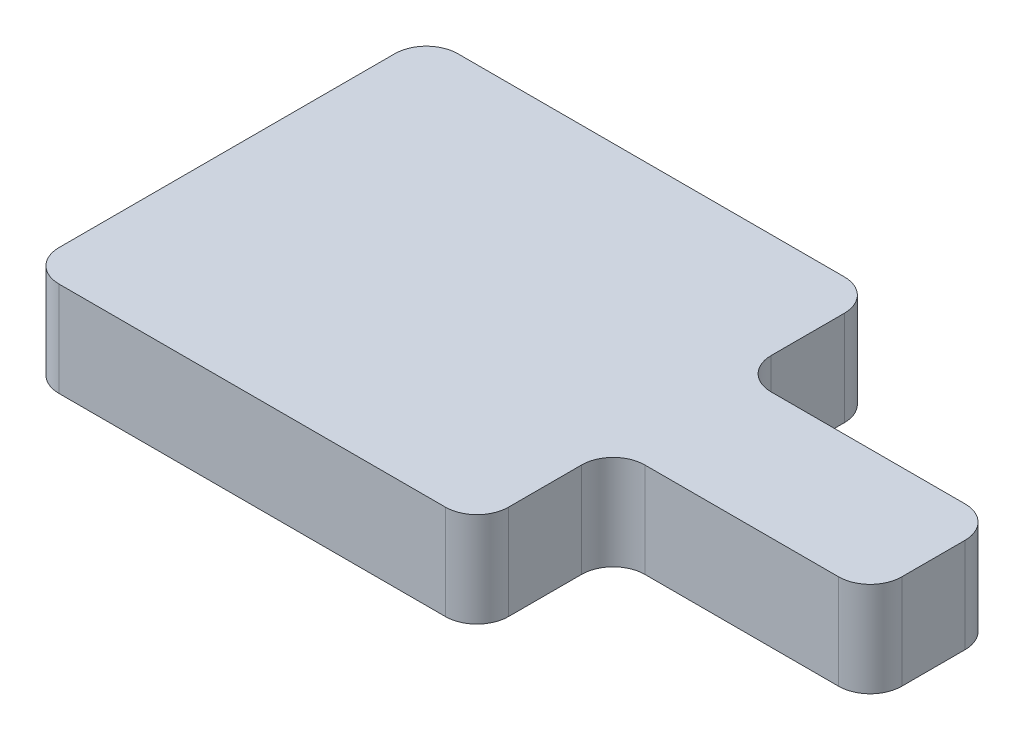
ISO-10303-21;
HEADER;
FILE_DESCRIPTION(('STEP AP214'),'2;1');
FILE_NAME('part.step','',(''),(''),'','','');
FILE_SCHEMA(('AUTOMOTIVE_DESIGN { 1 0 10303 214 1 1 1 1 }'));
ENDSEC;
DATA;
#1=APPLICATION_CONTEXT('core data for automotive mechanical design processes');
#2=APPLICATION_PROTOCOL_DEFINITION('international standard','automotive_design',2000,#1);
#3=PRODUCT_CONTEXT('',#1,'mechanical');
#4=PRODUCT('Part','Part','',(#3));
#5=PRODUCT_RELATED_PRODUCT_CATEGORY('part','',(#4));
#6=PRODUCT_DEFINITION_FORMATION('','',#4);
#7=PRODUCT_DEFINITION_CONTEXT('part definition',#1,'design');
#8=PRODUCT_DEFINITION('design','',#6,#7);
#9=PRODUCT_DEFINITION_SHAPE('','',#8);
#10=(LENGTH_UNIT() NAMED_UNIT(*) SI_UNIT(.MILLI.,.METRE.));
#11=(NAMED_UNIT(*) PLANE_ANGLE_UNIT() SI_UNIT($,.RADIAN.));
#12=(NAMED_UNIT(*) SI_UNIT($,.STERADIAN.) SOLID_ANGLE_UNIT());
#13=UNCERTAINTY_MEASURE_WITH_UNIT(LENGTH_MEASURE(1.E-05),#10,'distance_accuracy_value','');
#14=(GEOMETRIC_REPRESENTATION_CONTEXT(3) GLOBAL_UNCERTAINTY_ASSIGNED_CONTEXT((#13)) GLOBAL_UNIT_ASSIGNED_CONTEXT((#10,
#11,#12)) REPRESENTATION_CONTEXT('',''));
#15=CARTESIAN_POINT('',(0.,0.,0.));
#16=DIRECTION('',(0.,0.,1.));
#17=DIRECTION('',(1.,0.,0.));
#18=AXIS2_PLACEMENT_3D('',#15,#16,#17);
#19=CARTESIAN_POINT('',(83.9903657583398,-19.05,-6.35));
#20=DIRECTION('',(0.,1.,0.));
#21=DIRECTION('',(0.,0.,1.));
#22=AXIS2_PLACEMENT_3D('',#19,#20,#21);
#23=CYLINDRICAL_SURFACE('',#22,6.35);
#24=CARTESIAN_POINT('',(83.9903657583398,0.,-6.35));
#25=DIRECTION('',(0.,1.,0.));
#26=DIRECTION('',(0.,0.,1.));
#27=AXIS2_PLACEMENT_3D('',#24,#25,#26);
#28=CIRCLE('',#27,6.35);
#29=CARTESIAN_POINT('',(83.9903657583397,0.,0.));
#30=VERTEX_POINT('',#29);
#31=CARTESIAN_POINT('',(90.3403657583398,0.,-6.35));
#32=VERTEX_POINT('',#31);
#33=EDGE_CURVE('E176',#30,#32,#28,.T.);
#34=ORIENTED_EDGE('',*,*,#33,.F.);
#35=DIRECTION('',(0.,1.,0.));
#36=VECTOR('',#35,1.);
#37=CARTESIAN_POINT('',(83.9903657583397,-19.05,0.));
#38=LINE('',#37,#36);
#39=CARTESIAN_POINT('',(83.9903657583397,-19.05,0.));
#40=VERTEX_POINT('',#39);
#41=EDGE_CURVE('E11',#40,#30,#38,.T.);
#42=ORIENTED_EDGE('',*,*,#41,.F.);
#43=CARTESIAN_POINT('',(83.9903657583398,-19.05,-6.35));
#44=DIRECTION('',(0.,1.,0.));
#45=DIRECTION('',(0.,0.,1.));
#46=AXIS2_PLACEMENT_3D('',#43,#44,#45);
#47=CIRCLE('',#46,6.35);
#48=CARTESIAN_POINT('',(90.3403657583398,-19.05,-6.35));
#49=VERTEX_POINT('',#48);
#50=EDGE_CURVE('E220',#40,#49,#47,.T.);
#51=ORIENTED_EDGE('',*,*,#50,.T.);
#52=DIRECTION('',(0.,1.,0.));
#53=VECTOR('',#52,1.);
#54=CARTESIAN_POINT('',(90.3403657583398,-19.05,-6.35));
#55=LINE('',#54,#53);
#56=EDGE_CURVE('E34',#49,#32,#55,.T.);
#57=ORIENTED_EDGE('',*,*,#56,.T.);
#58=EDGE_LOOP('',(#34,#42,#51,#57));
#59=FACE_BOUND('',#58,.T.);
#60=ADVANCED_FACE('F31',(#59),#23,.T.);
#61=CARTESIAN_POINT('',(6.35,-19.05,0.));
#62=DIRECTION('',(0.,0.,1.));
#63=DIRECTION('',(1.,0.,0.));
#64=AXIS2_PLACEMENT_3D('',#61,#62,#63);
#65=PLANE('',#64);
#66=DIRECTION('',(1.,0.,0.));
#67=VECTOR('',#66,1.);
#68=CARTESIAN_POINT('',(6.35,0.,0.));
#69=LINE('',#68,#67);
#70=CARTESIAN_POINT('',(6.35,0.,0.));
#71=VERTEX_POINT('',#70);
#72=EDGE_CURVE('E218',#71,#30,#69,.T.);
#73=ORIENTED_EDGE('',*,*,#72,.F.);
#74=DIRECTION('',(0.,1.,0.));
#75=VECTOR('',#74,1.);
#76=CARTESIAN_POINT('',(6.35,-19.05,0.));
#77=LINE('',#76,#75);
#78=CARTESIAN_POINT('',(6.35,-19.05,0.));
#79=VERTEX_POINT('',#78);
#80=EDGE_CURVE('E40',#79,#71,#77,.T.);
#81=ORIENTED_EDGE('',*,*,#80,.F.);
#82=DIRECTION('',(1.,0.,0.));
#83=VECTOR('',#82,1.);
#84=CARTESIAN_POINT('',(6.35,-19.05,0.));
#85=LINE('',#84,#83);
#86=EDGE_CURVE('E166',#79,#40,#85,.T.);
#87=ORIENTED_EDGE('',*,*,#86,.T.);
#88=ORIENTED_EDGE('',*,*,#41,.T.);
#89=EDGE_LOOP('',(#73,#81,#87,#88));
#90=FACE_BOUND('',#89,.T.);
#91=ADVANCED_FACE('F248',(#90),#65,.T.);
#92=CARTESIAN_POINT('',(6.35,-19.05,-6.35));
#93=DIRECTION('',(0.,1.,0.));
#94=DIRECTION('',(0.,0.,1.));
#95=AXIS2_PLACEMENT_3D('',#92,#93,#94);
#96=CYLINDRICAL_SURFACE('',#95,6.35);
#97=CARTESIAN_POINT('',(6.35,0.,-6.35));
#98=DIRECTION('',(0.,1.,0.));
#99=DIRECTION('',(0.,0.,-1.));
#100=AXIS2_PLACEMENT_3D('',#97,#98,#99);
#101=CIRCLE('',#100,6.35);
#102=CARTESIAN_POINT('',(0.,0.,-6.35));
#103=VERTEX_POINT('',#102);
#104=EDGE_CURVE('E153',#103,#71,#101,.T.);
#105=ORIENTED_EDGE('',*,*,#104,.F.);
#106=DIRECTION('',(0.,1.,0.));
#107=VECTOR('',#106,1.);
#108=CARTESIAN_POINT('',(0.,-19.05,-6.35));
#109=LINE('',#108,#107);
#110=CARTESIAN_POINT('',(0.,-19.05,-6.35));
#111=VERTEX_POINT('',#110);
#112=EDGE_CURVE('E148',#111,#103,#109,.T.);
#113=ORIENTED_EDGE('',*,*,#112,.F.);
#114=CARTESIAN_POINT('',(6.35,-19.05,-6.35));
#115=DIRECTION('',(0.,1.,0.));
#116=DIRECTION('',(0.,0.,-1.));
#117=AXIS2_PLACEMENT_3D('',#114,#115,#116);
#118=CIRCLE('',#117,6.35);
#119=EDGE_CURVE('E151',#111,#79,#118,.T.);
#120=ORIENTED_EDGE('',*,*,#119,.T.);
#121=ORIENTED_EDGE('',*,*,#80,.T.);
#122=EDGE_LOOP('',(#105,#113,#120,#121));
#123=FACE_BOUND('',#122,.T.);
#124=ADVANCED_FACE('F150',(#123),#96,.T.);
#125=CARTESIAN_POINT('',(0.,-19.05,-6.35));
#126=DIRECTION('',(-1.,0.,0.));
#127=DIRECTION('',(0.,0.,1.));
#128=AXIS2_PLACEMENT_3D('',#125,#126,#127);
#129=PLANE('',#128);
#130=DIRECTION('',(0.,0.,1.));
#131=VECTOR('',#130,1.);
#132=CARTESIAN_POINT('',(0.,0.,-6.35));
#133=LINE('',#132,#131);
#134=CARTESIAN_POINT('',(0.,0.,-73.8109677822809));
#135=VERTEX_POINT('',#134);
#136=EDGE_CURVE('E215',#135,#103,#133,.T.);
#137=ORIENTED_EDGE('',*,*,#136,.F.);
#138=DIRECTION('',(0.,1.,0.));
#139=VECTOR('',#138,1.);
#140=CARTESIAN_POINT('',(0.,-19.05,-73.8109677822809));
#141=LINE('',#140,#139);
#142=CARTESIAN_POINT('',(0.,-19.05,-73.8109677822809));
#143=VERTEX_POINT('',#142);
#144=EDGE_CURVE('E158',#143,#135,#141,.T.);
#145=ORIENTED_EDGE('',*,*,#144,.F.);
#146=DIRECTION('',(0.,0.,1.));
#147=VECTOR('',#146,1.);
#148=CARTESIAN_POINT('',(0.,-19.05,-6.35));
#149=LINE('',#148,#147);
#150=EDGE_CURVE('E164',#143,#111,#149,.T.);
#151=ORIENTED_EDGE('',*,*,#150,.T.);
#152=ORIENTED_EDGE('',*,*,#112,.T.);
#153=EDGE_LOOP('',(#137,#145,#151,#152));
#154=FACE_BOUND('',#153,.T.);
#155=ADVANCED_FACE('F168',(#154),#129,.T.);
#156=CARTESIAN_POINT('',(6.35,-19.05,-73.8109677822809));
#157=DIRECTION('',(0.,1.,0.));
#158=DIRECTION('',(0.,0.,1.));
#159=AXIS2_PLACEMENT_3D('',#156,#157,#158);
#160=CYLINDRICAL_SURFACE('',#159,6.35);
#161=CARTESIAN_POINT('',(6.35,0.,-73.8109677822809));
#162=DIRECTION('',(0.,1.,0.));
#163=DIRECTION('',(0.,0.,1.));
#164=AXIS2_PLACEMENT_3D('',#161,#162,#163);
#165=CIRCLE('',#164,6.35);
#166=CARTESIAN_POINT('',(6.35,0.,-80.1609677822809));
#167=VERTEX_POINT('',#166);
#168=EDGE_CURVE('E212',#167,#135,#165,.T.);
#169=ORIENTED_EDGE('',*,*,#168,.F.);
#170=DIRECTION('',(0.,1.,0.));
#171=VECTOR('',#170,1.);
#172=CARTESIAN_POINT('',(6.35,-19.05,-80.1609677822809));
#173=LINE('',#172,#171);
#174=CARTESIAN_POINT('',(6.35,-19.05,-80.1609677822809));
#175=VERTEX_POINT('',#174);
#176=EDGE_CURVE('E224',#175,#167,#173,.T.);
#177=ORIENTED_EDGE('',*,*,#176,.F.);
#178=CARTESIAN_POINT('',(6.35,-19.05,-73.8109677822809));
#179=DIRECTION('',(0.,1.,0.));
#180=DIRECTION('',(0.,0.,1.));
#181=AXIS2_PLACEMENT_3D('',#178,#179,#180);
#182=CIRCLE('',#181,6.35);
#183=EDGE_CURVE('E169',#175,#143,#182,.T.);
#184=ORIENTED_EDGE('',*,*,#183,.T.);
#185=ORIENTED_EDGE('',*,*,#144,.T.);
#186=EDGE_LOOP('',(#169,#177,#184,#185));
#187=FACE_BOUND('',#186,.T.);
#188=ADVANCED_FACE('F261',(#187),#160,.T.);
#189=CARTESIAN_POINT('',(6.35,-19.05,-80.1609677822809));
#190=DIRECTION('',(0.,0.,-1.));
#191=DIRECTION('',(-1.,0.,0.));
#192=AXIS2_PLACEMENT_3D('',#189,#190,#191);
#193=PLANE('',#192);
#194=DIRECTION('',(-1.,0.,0.));
#195=VECTOR('',#194,1.);
#196=CARTESIAN_POINT('',(6.35,0.,-80.1609677822809));
#197=LINE('',#196,#195);
#198=CARTESIAN_POINT('',(83.9903657583398,0.,-80.1609677822809));
#199=VERTEX_POINT('',#198);
#200=EDGE_CURVE('E209',#199,#167,#197,.T.);
#201=ORIENTED_EDGE('',*,*,#200,.F.);
#202=DIRECTION('',(0.,1.,0.));
#203=VECTOR('',#202,1.);
#204=CARTESIAN_POINT('',(83.9903657583398,-19.05,-80.1609677822809));
#205=LINE('',#204,#203);
#206=CARTESIAN_POINT('',(83.9903657583398,-19.05,-80.1609677822809));
#207=VERTEX_POINT('',#206);
#208=EDGE_CURVE('E226',#207,#199,#205,.T.);
#209=ORIENTED_EDGE('',*,*,#208,.F.);
#210=DIRECTION('',(-1.,0.,0.));
#211=VECTOR('',#210,1.);
#212=CARTESIAN_POINT('',(6.35,-19.05,-80.1609677822809));
#213=LINE('',#212,#211);
#214=EDGE_CURVE('E171',#207,#175,#213,.T.);
#215=ORIENTED_EDGE('',*,*,#214,.T.);
#216=ORIENTED_EDGE('',*,*,#176,.T.);
#217=EDGE_LOOP('',(#201,#209,#215,#216));
#218=FACE_BOUND('',#217,.T.);
#219=ADVANCED_FACE('F264',(#218),#193,.T.);
#220=CARTESIAN_POINT('',(83.9903657583398,-19.05,-73.8109677822809));
#221=DIRECTION('',(0.,1.,0.));
#222=DIRECTION('',(0.,0.,1.));
#223=AXIS2_PLACEMENT_3D('',#220,#221,#222);
#224=CYLINDRICAL_SURFACE('',#223,6.34999999999999);
#225=CARTESIAN_POINT('',(83.9903657583398,0.,-73.8109677822809));
#226=DIRECTION('',(0.,1.,0.));
#227=DIRECTION('',(0.,0.,-1.));
#228=AXIS2_PLACEMENT_3D('',#225,#226,#227);
#229=CIRCLE('',#228,6.34999999999999);
#230=CARTESIAN_POINT('',(90.3403657583398,0.,-73.8109677822809));
#231=VERTEX_POINT('',#230);
#232=EDGE_CURVE('E206',#231,#199,#229,.T.);
#233=ORIENTED_EDGE('',*,*,#232,.F.);
#234=DIRECTION('',(0.,1.,0.));
#235=VECTOR('',#234,1.);
#236=CARTESIAN_POINT('',(90.3403657583398,-19.05,-73.8109677822809));
#237=LINE('',#236,#235);
#238=CARTESIAN_POINT('',(90.3403657583398,-19.05,-73.8109677822809));
#239=VERTEX_POINT('',#238);
#240=EDGE_CURVE('E228',#239,#231,#237,.T.);
#241=ORIENTED_EDGE('',*,*,#240,.F.);
#242=CARTESIAN_POINT('',(83.9903657583398,-19.05,-73.8109677822809));
#243=DIRECTION('',(0.,1.,0.));
#244=DIRECTION('',(0.,0.,-1.));
#245=AXIS2_PLACEMENT_3D('',#242,#243,#244);
#246=CIRCLE('',#245,6.34999999999999);
#247=EDGE_CURVE('E445',#239,#207,#246,.T.);
#248=ORIENTED_EDGE('',*,*,#247,.T.);
#249=ORIENTED_EDGE('',*,*,#208,.T.);
#250=EDGE_LOOP('',(#233,#241,#248,#249));
#251=FACE_BOUND('',#250,.T.);
#252=ADVANCED_FACE('F268',(#251),#224,.T.);
#253=CARTESIAN_POINT('',(90.3403657583398,-19.05,-73.8109677822809));
#254=DIRECTION('',(1.,0.,0.));
#255=DIRECTION('',(0.,0.,-1.));
#256=AXIS2_PLACEMENT_3D('',#253,#254,#255);
#257=PLANE('',#256);
#258=DIRECTION('',(0.,0.,-1.));
#259=VECTOR('',#258,1.);
#260=CARTESIAN_POINT('',(90.3403657583398,0.,-73.8109677822809));
#261=LINE('',#260,#259);
#262=CARTESIAN_POINT('',(90.3403657583398,0.,-59.1304838911404));
#263=VERTEX_POINT('',#262);
#264=EDGE_CURVE('E203',#263,#231,#261,.T.);
#265=ORIENTED_EDGE('',*,*,#264,.F.);
#266=DIRECTION('',(0.,1.,0.));
#267=VECTOR('',#266,1.);
#268=CARTESIAN_POINT('',(90.3403657583398,-19.05,-59.1304838911404));
#269=LINE('',#268,#267);
#270=CARTESIAN_POINT('',(90.3403657583398,-19.05,-59.1304838911404));
#271=VERTEX_POINT('',#270);
#272=EDGE_CURVE('E230',#271,#263,#269,.T.);
#273=ORIENTED_EDGE('',*,*,#272,.F.);
#274=DIRECTION('',(0.,0.,-1.));
#275=VECTOR('',#274,1.);
#276=CARTESIAN_POINT('',(90.3403657583398,-19.05,-73.8109677822809));
#277=LINE('',#276,#275);
#278=EDGE_CURVE('E441',#271,#239,#277,.T.);
#279=ORIENTED_EDGE('',*,*,#278,.T.);
#280=ORIENTED_EDGE('',*,*,#240,.T.);
#281=EDGE_LOOP('',(#265,#273,#279,#280));
#282=FACE_BOUND('',#281,.T.);
#283=ADVANCED_FACE('F272',(#282),#257,.T.);
#284=CARTESIAN_POINT('',(96.6903657583398,-19.05,-59.1304838911404));
#285=DIRECTION('',(0.,1.,0.));
#286=DIRECTION('',(0.,0.,1.));
#287=AXIS2_PLACEMENT_3D('',#284,#285,#286);
#288=CYLINDRICAL_SURFACE('',#287,6.35);
#289=CARTESIAN_POINT('',(96.6903657583398,0.,-59.1304838911404));
#290=DIRECTION('',(0.,-1.,0.));
#291=DIRECTION('',(0.,0.,1.));
#292=AXIS2_PLACEMENT_3D('',#289,#290,#291);
#293=CIRCLE('',#292,6.35);
#294=CARTESIAN_POINT('',(96.6903657583398,0.,-52.7804838911404));
#295=VERTEX_POINT('',#294);
#296=EDGE_CURVE('E200',#295,#263,#293,.T.);
#297=ORIENTED_EDGE('',*,*,#296,.F.);
#298=DIRECTION('',(0.,1.,0.));
#299=VECTOR('',#298,1.);
#300=CARTESIAN_POINT('',(96.6903657583398,-19.05,-52.7804838911404));
#301=LINE('',#300,#299);
#302=CARTESIAN_POINT('',(96.6903657583398,-19.05,-52.7804838911404));
#303=VERTEX_POINT('',#302);
#304=EDGE_CURVE('E232',#303,#295,#301,.T.);
#305=ORIENTED_EDGE('',*,*,#304,.F.);
#306=CARTESIAN_POINT('',(96.6903657583398,-19.05,-59.1304838911404));
#307=DIRECTION('',(0.,-1.,0.));
#308=DIRECTION('',(0.,0.,1.));
#309=AXIS2_PLACEMENT_3D('',#306,#307,#308);
#310=CIRCLE('',#309,6.35);
#311=EDGE_CURVE('E452',#303,#271,#310,.T.);
#312=ORIENTED_EDGE('',*,*,#311,.T.);
#313=ORIENTED_EDGE('',*,*,#272,.T.);
#314=EDGE_LOOP('',(#297,#305,#312,#313));
#315=FACE_BOUND('',#314,.T.);
#316=ADVANCED_FACE('F276',(#315),#288,.F.);
#317=CARTESIAN_POINT('',(96.6903657583398,-19.05,-52.7804838911404));
#318=DIRECTION('',(0.,0.,-1.));
#319=DIRECTION('',(-1.,0.,0.));
#320=AXIS2_PLACEMENT_3D('',#317,#318,#319);
#321=PLANE('',#320);
#322=DIRECTION('',(-1.,0.,0.));
#323=VECTOR('',#322,1.);
#324=CARTESIAN_POINT('',(96.6903657583398,0.,-52.7804838911404));
#325=LINE('',#324,#323);
#326=CARTESIAN_POINT('',(135.628548362878,0.,-52.7804838911404));
#327=VERTEX_POINT('',#326);
#328=EDGE_CURVE('E197',#327,#295,#325,.T.);
#329=ORIENTED_EDGE('',*,*,#328,.F.);
#330=DIRECTION('',(0.,1.,0.));
#331=VECTOR('',#330,1.);
#332=CARTESIAN_POINT('',(135.628548362878,-19.05,-52.7804838911404));
#333=LINE('',#332,#331);
#334=CARTESIAN_POINT('',(135.628548362878,-19.05,-52.7804838911404));
#335=VERTEX_POINT('',#334);
#336=EDGE_CURVE('E234',#335,#327,#333,.T.);
#337=ORIENTED_EDGE('',*,*,#336,.F.);
#338=DIRECTION('',(-1.,0.,0.));
#339=VECTOR('',#338,1.);
#340=CARTESIAN_POINT('',(96.6903657583398,-19.05,-52.7804838911404));
#341=LINE('',#340,#339);
#342=EDGE_CURVE('E434',#335,#303,#341,.T.);
#343=ORIENTED_EDGE('',*,*,#342,.T.);
#344=ORIENTED_EDGE('',*,*,#304,.T.);
#345=EDGE_LOOP('',(#329,#337,#343,#344));
#346=FACE_BOUND('',#345,.T.);
#347=ADVANCED_FACE('F280',(#346),#321,.T.);
#348=CARTESIAN_POINT('',(135.628548362878,-19.05,-46.4304838911404));
#349=DIRECTION('',(0.,1.,0.));
#350=DIRECTION('',(0.,0.,1.));
#351=AXIS2_PLACEMENT_3D('',#348,#349,#350);
#352=CYLINDRICAL_SURFACE('',#351,6.35);
#353=CARTESIAN_POINT('',(135.628548362878,0.,-46.4304838911404));
#354=DIRECTION('',(0.,1.,0.));
#355=DIRECTION('',(0.,0.,-1.));
#356=AXIS2_PLACEMENT_3D('',#353,#354,#355);
#357=CIRCLE('',#356,6.35);
#358=CARTESIAN_POINT('',(141.978548362878,0.,-46.4304838911404));
#359=VERTEX_POINT('',#358);
#360=EDGE_CURVE('E194',#359,#327,#357,.T.);
#361=ORIENTED_EDGE('',*,*,#360,.F.);
#362=DIRECTION('',(0.,1.,0.));
#363=VECTOR('',#362,1.);
#364=CARTESIAN_POINT('',(141.978548362878,-19.05,-46.4304838911404));
#365=LINE('',#364,#363);
#366=CARTESIAN_POINT('',(141.978548362878,-19.05,-46.4304838911404));
#367=VERTEX_POINT('',#366);
#368=EDGE_CURVE('E236',#367,#359,#365,.T.);
#369=ORIENTED_EDGE('',*,*,#368,.F.);
#370=CARTESIAN_POINT('',(135.628548362878,-19.05,-46.4304838911404));
#371=DIRECTION('',(0.,1.,0.));
#372=DIRECTION('',(0.,0.,-1.));
#373=AXIS2_PLACEMENT_3D('',#370,#371,#372);
#374=CIRCLE('',#373,6.35);
#375=EDGE_CURVE('E430',#367,#335,#374,.T.);
#376=ORIENTED_EDGE('',*,*,#375,.T.);
#377=ORIENTED_EDGE('',*,*,#336,.T.);
#378=EDGE_LOOP('',(#361,#369,#376,#377));
#379=FACE_BOUND('',#378,.T.);
#380=ADVANCED_FACE('F284',(#379),#352,.T.);
#381=CARTESIAN_POINT('',(141.978548362878,-19.05,-33.7304838911404));
#382=DIRECTION('',(1.,0.,0.));
#383=DIRECTION('',(0.,0.,-1.));
#384=AXIS2_PLACEMENT_3D('',#381,#382,#383);
#385=PLANE('',#384);
#386=DIRECTION('',(0.,0.,-1.));
#387=VECTOR('',#386,1.);
#388=CARTESIAN_POINT('',(141.978548362878,0.,-33.7304838911404));
#389=LINE('',#388,#387);
#390=CARTESIAN_POINT('',(141.978548362878,0.,-33.7304838911404));
#391=VERTEX_POINT('',#390);
#392=EDGE_CURVE('E191',#391,#359,#389,.T.);
#393=ORIENTED_EDGE('',*,*,#392,.F.);
#394=DIRECTION('',(0.,1.,0.));
#395=VECTOR('',#394,1.);
#396=CARTESIAN_POINT('',(141.978548362878,-19.05,-33.7304838911404));
#397=LINE('',#396,#395);
#398=CARTESIAN_POINT('',(141.978548362878,-19.05,-33.7304838911404));
#399=VERTEX_POINT('',#398);
#400=EDGE_CURVE('E238',#399,#391,#397,.T.);
#401=ORIENTED_EDGE('',*,*,#400,.F.);
#402=DIRECTION('',(0.,0.,-1.));
#403=VECTOR('',#402,1.);
#404=CARTESIAN_POINT('',(141.978548362878,-19.05,-33.7304838911404));
#405=LINE('',#404,#403);
#406=EDGE_CURVE('E456',#399,#367,#405,.T.);
#407=ORIENTED_EDGE('',*,*,#406,.T.);
#408=ORIENTED_EDGE('',*,*,#368,.T.);
#409=EDGE_LOOP('',(#393,#401,#407,#408));
#410=FACE_BOUND('',#409,.T.);
#411=ADVANCED_FACE('F288',(#410),#385,.T.);
#412=CARTESIAN_POINT('',(135.628548362878,-19.05,-33.7304838911404));
#413=DIRECTION('',(0.,1.,0.));
#414=DIRECTION('',(0.,0.,1.));
#415=AXIS2_PLACEMENT_3D('',#412,#413,#414);
#416=CYLINDRICAL_SURFACE('',#415,6.35);
#417=CARTESIAN_POINT('',(135.628548362878,0.,-33.7304838911404));
#418=DIRECTION('',(0.,1.,0.));
#419=DIRECTION('',(0.,0.,-1.));
#420=AXIS2_PLACEMENT_3D('',#417,#418,#419);
#421=CIRCLE('',#420,6.35);
#422=CARTESIAN_POINT('',(135.628548362878,0.,-27.3804838911404));
#423=VERTEX_POINT('',#422);
#424=EDGE_CURVE('E188',#423,#391,#421,.T.);
#425=ORIENTED_EDGE('',*,*,#424,.F.);
#426=DIRECTION('',(0.,1.,0.));
#427=VECTOR('',#426,1.);
#428=CARTESIAN_POINT('',(135.628548362878,-19.05,-27.3804838911404));
#429=LINE('',#428,#427);
#430=CARTESIAN_POINT('',(135.628548362878,-19.05,-27.3804838911404));
#431=VERTEX_POINT('',#430);
#432=EDGE_CURVE('E240',#431,#423,#429,.T.);
#433=ORIENTED_EDGE('',*,*,#432,.F.);
#434=CARTESIAN_POINT('',(135.628548362878,-19.05,-33.7304838911404));
#435=DIRECTION('',(0.,1.,0.));
#436=DIRECTION('',(0.,0.,-1.));
#437=AXIS2_PLACEMENT_3D('',#434,#435,#436);
#438=CIRCLE('',#437,6.35);
#439=EDGE_CURVE('E423',#431,#399,#438,.T.);
#440=ORIENTED_EDGE('',*,*,#439,.T.);
#441=ORIENTED_EDGE('',*,*,#400,.T.);
#442=EDGE_LOOP('',(#425,#433,#440,#441));
#443=FACE_BOUND('',#442,.T.);
#444=ADVANCED_FACE('F292',(#443),#416,.T.);
#445=CARTESIAN_POINT('',(96.6903657583398,-19.05,-27.3804838911404));
#446=DIRECTION('',(0.,0.,1.));
#447=DIRECTION('',(1.,0.,0.));
#448=AXIS2_PLACEMENT_3D('',#445,#446,#447);
#449=PLANE('',#448);
#450=DIRECTION('',(1.,0.,0.));
#451=VECTOR('',#450,1.);
#452=CARTESIAN_POINT('',(96.6903657583398,0.,-27.3804838911404));
#453=LINE('',#452,#451);
#454=CARTESIAN_POINT('',(96.6903657583398,0.,-27.3804838911404));
#455=VERTEX_POINT('',#454);
#456=EDGE_CURVE('E185',#455,#423,#453,.T.);
#457=ORIENTED_EDGE('',*,*,#456,.F.);
#458=DIRECTION('',(0.,1.,0.));
#459=VECTOR('',#458,1.);
#460=CARTESIAN_POINT('',(96.6903657583398,-19.05,-27.3804838911404));
#461=LINE('',#460,#459);
#462=CARTESIAN_POINT('',(96.6903657583398,-19.05,-27.3804838911404));
#463=VERTEX_POINT('',#462);
#464=EDGE_CURVE('E242',#463,#455,#461,.T.);
#465=ORIENTED_EDGE('',*,*,#464,.F.);
#466=DIRECTION('',(1.,0.,0.));
#467=VECTOR('',#466,1.);
#468=CARTESIAN_POINT('',(96.6903657583398,-19.05,-27.3804838911404));
#469=LINE('',#468,#467);
#470=EDGE_CURVE('E419',#463,#431,#469,.T.);
#471=ORIENTED_EDGE('',*,*,#470,.T.);
#472=ORIENTED_EDGE('',*,*,#432,.T.);
#473=EDGE_LOOP('',(#457,#465,#471,#472));
#474=FACE_BOUND('',#473,.T.);
#475=ADVANCED_FACE('F296',(#474),#449,.T.);
#476=CARTESIAN_POINT('',(96.6903657583398,-19.05,-21.0304838911404));
#477=DIRECTION('',(0.,1.,0.));
#478=DIRECTION('',(0.,0.,1.));
#479=AXIS2_PLACEMENT_3D('',#476,#477,#478);
#480=CYLINDRICAL_SURFACE('',#479,6.34999999999999);
#481=CARTESIAN_POINT('',(96.6903657583398,0.,-21.0304838911404));
#482=DIRECTION('',(0.,-1.,0.));
#483=DIRECTION('',(0.,0.,-1.));
#484=AXIS2_PLACEMENT_3D('',#481,#482,#483);
#485=CIRCLE('',#484,6.34999999999999);
#486=CARTESIAN_POINT('',(90.3403657583398,0.,-21.0304838911404));
#487=VERTEX_POINT('',#486);
#488=EDGE_CURVE('E182',#487,#455,#485,.T.);
#489=ORIENTED_EDGE('',*,*,#488,.F.);
#490=DIRECTION('',(0.,1.,0.));
#491=VECTOR('',#490,1.);
#492=CARTESIAN_POINT('',(90.3403657583398,-19.05,-21.0304838911404));
#493=LINE('',#492,#491);
#494=CARTESIAN_POINT('',(90.3403657583398,-19.05,-21.0304838911404));
#495=VERTEX_POINT('',#494);
#496=EDGE_CURVE('E243',#495,#487,#493,.T.);
#497=ORIENTED_EDGE('',*,*,#496,.F.);
#498=CARTESIAN_POINT('',(96.6903657583398,-19.05,-21.0304838911404));
#499=DIRECTION('',(0.,-1.,0.));
#500=DIRECTION('',(0.,0.,-1.));
#501=AXIS2_PLACEMENT_3D('',#498,#499,#500);
#502=CIRCLE('',#501,6.34999999999999);
#503=EDGE_CURVE('E460',#495,#463,#502,.T.);
#504=ORIENTED_EDGE('',*,*,#503,.T.);
#505=ORIENTED_EDGE('',*,*,#464,.T.);
#506=EDGE_LOOP('',(#489,#497,#504,#505));
#507=FACE_BOUND('',#506,.T.);
#508=ADVANCED_FACE('F300',(#507),#480,.F.);
#509=CARTESIAN_POINT('',(90.3403657583398,-19.05,-6.35));
#510=DIRECTION('',(1.,0.,0.));
#511=DIRECTION('',(0.,0.,-1.));
#512=AXIS2_PLACEMENT_3D('',#509,#510,#511);
#513=PLANE('',#512);
#514=DIRECTION('',(0.,0.,-1.));
#515=VECTOR('',#514,1.);
#516=CARTESIAN_POINT('',(90.3403657583398,0.,-6.35));
#517=LINE('',#516,#515);
#518=EDGE_CURVE('E179',#32,#487,#517,.T.);
#519=ORIENTED_EDGE('',*,*,#518,.F.);
#520=ORIENTED_EDGE('',*,*,#56,.F.);
#521=DIRECTION('',(0.,0.,-1.));
#522=VECTOR('',#521,1.);
#523=CARTESIAN_POINT('',(90.3403657583398,-19.05,-6.35));
#524=LINE('',#523,#522);
#525=EDGE_CURVE('E462',#49,#495,#524,.T.);
#526=ORIENTED_EDGE('',*,*,#525,.T.);
#527=ORIENTED_EDGE('',*,*,#496,.T.);
#528=EDGE_LOOP('',(#519,#520,#526,#527));
#529=FACE_BOUND('',#528,.T.);
#530=ADVANCED_FACE('F245',(#529),#513,.T.);
#531=CARTESIAN_POINT('',(83.9903657583398,-19.05,-6.35));
#532=DIRECTION('',(0.,1.,0.));
#533=DIRECTION('',(0.,0.,1.));
#534=AXIS2_PLACEMENT_3D('',#531,#532,#533);
#535=PLANE('',#534);
#536=ORIENTED_EDGE('',*,*,#50,.F.);
#537=ORIENTED_EDGE('',*,*,#86,.F.);
#538=ORIENTED_EDGE('',*,*,#119,.F.);
#539=ORIENTED_EDGE('',*,*,#150,.F.);
#540=ORIENTED_EDGE('',*,*,#183,.F.);
#541=ORIENTED_EDGE('',*,*,#214,.F.);
#542=ORIENTED_EDGE('',*,*,#247,.F.);
#543=ORIENTED_EDGE('',*,*,#278,.F.);
#544=ORIENTED_EDGE('',*,*,#311,.F.);
#545=ORIENTED_EDGE('',*,*,#342,.F.);
#546=ORIENTED_EDGE('',*,*,#375,.F.);
#547=ORIENTED_EDGE('',*,*,#406,.F.);
#548=ORIENTED_EDGE('',*,*,#439,.F.);
#549=ORIENTED_EDGE('',*,*,#470,.F.);
#550=ORIENTED_EDGE('',*,*,#503,.F.);
#551=ORIENTED_EDGE('',*,*,#525,.F.);
#552=EDGE_LOOP('',(#536,#537,#538,#539,#540,#541,#542,#543,#544,#545,#546,#547,#548,#549,#550,#551));
#553=FACE_BOUND('',#552,.T.);
#554=ADVANCED_FACE('F162',(#553),#535,.F.);
#555=CARTESIAN_POINT('',(83.9903657583398,0.,-6.35));
#556=DIRECTION('',(0.,1.,0.));
#557=DIRECTION('',(0.,0.,1.));
#558=AXIS2_PLACEMENT_3D('',#555,#556,#557);
#559=PLANE('',#558);
#560=ORIENTED_EDGE('',*,*,#33,.T.);
#561=ORIENTED_EDGE('',*,*,#518,.T.);
#562=ORIENTED_EDGE('',*,*,#488,.T.);
#563=ORIENTED_EDGE('',*,*,#456,.T.);
#564=ORIENTED_EDGE('',*,*,#424,.T.);
#565=ORIENTED_EDGE('',*,*,#392,.T.);
#566=ORIENTED_EDGE('',*,*,#360,.T.);
#567=ORIENTED_EDGE('',*,*,#328,.T.);
#568=ORIENTED_EDGE('',*,*,#296,.T.);
#569=ORIENTED_EDGE('',*,*,#264,.T.);
#570=ORIENTED_EDGE('',*,*,#232,.T.);
#571=ORIENTED_EDGE('',*,*,#200,.T.);
#572=ORIENTED_EDGE('',*,*,#168,.T.);
#573=ORIENTED_EDGE('',*,*,#136,.T.);
#574=ORIENTED_EDGE('',*,*,#104,.T.);
#575=ORIENTED_EDGE('',*,*,#72,.T.);
#576=EDGE_LOOP('',(#560,#561,#562,#563,#564,#565,#566,#567,#568,#569,#570,#571,#572,#573,#574,#575));
#577=FACE_BOUND('',#576,.T.);
#578=ADVANCED_FACE('F247',(#577),#559,.T.);
#579=CLOSED_SHELL('',(#60,#91,#124,#155,#188,#219,#252,#283,#316,#347,#380,#411,#444,#475,#508,
#530,#554,#578));
#580=MANIFOLD_SOLID_BREP('B2',#579);
#581=ADVANCED_BREP_SHAPE_REPRESENTATION('',(#18,#580),#14);
#582=SHAPE_DEFINITION_REPRESENTATION(#9,#581);
ENDSEC;
END-ISO-10303-21;
